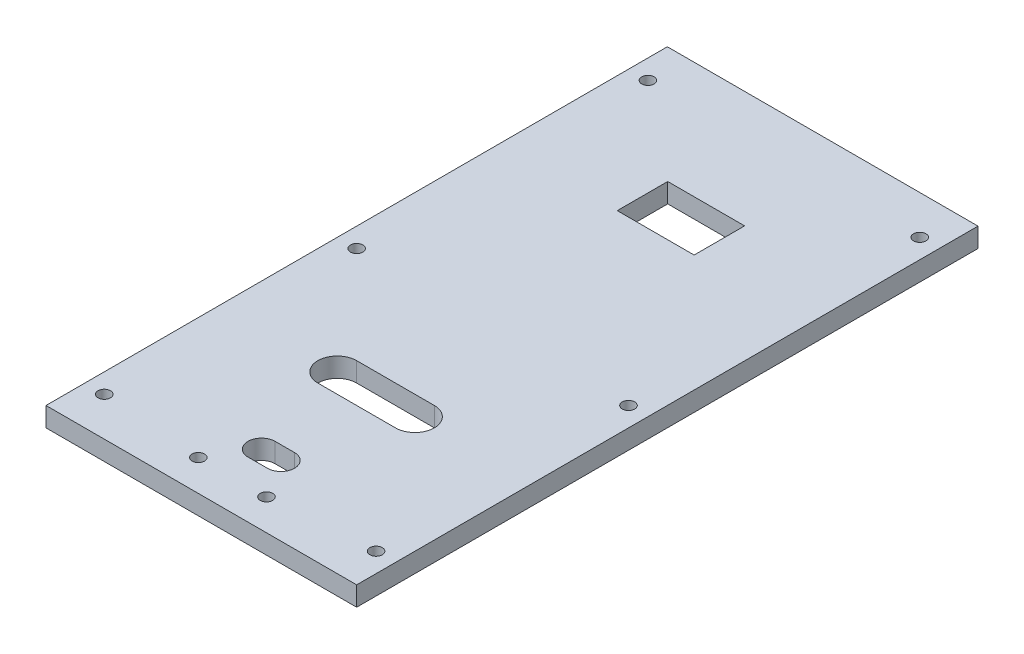
ISO-10303-21;
HEADER;
FILE_DESCRIPTION(('STEP AP214'),'2;1');
FILE_NAME('part.step','',(''),(''),'','','');
FILE_SCHEMA(('AUTOMOTIVE_DESIGN { 1 0 10303 214 1 1 1 1 }'));
ENDSEC;
DATA;
#1=APPLICATION_CONTEXT('core data for automotive mechanical design processes');
#2=APPLICATION_PROTOCOL_DEFINITION('international standard','automotive_design',2000,#1);
#3=PRODUCT_CONTEXT('',#1,'mechanical');
#4=PRODUCT('Part','Part','',(#3));
#5=PRODUCT_RELATED_PRODUCT_CATEGORY('part','',(#4));
#6=PRODUCT_DEFINITION_FORMATION('','',#4);
#7=PRODUCT_DEFINITION_CONTEXT('part definition',#1,'design');
#8=PRODUCT_DEFINITION('design','',#6,#7);
#9=PRODUCT_DEFINITION_SHAPE('','',#8);
#10=(LENGTH_UNIT() NAMED_UNIT(*) SI_UNIT(.MILLI.,.METRE.));
#11=(NAMED_UNIT(*) PLANE_ANGLE_UNIT() SI_UNIT($,.RADIAN.));
#12=(NAMED_UNIT(*) SI_UNIT($,.STERADIAN.) SOLID_ANGLE_UNIT());
#13=UNCERTAINTY_MEASURE_WITH_UNIT(LENGTH_MEASURE(1.E-05),#10,'distance_accuracy_value','');
#14=(GEOMETRIC_REPRESENTATION_CONTEXT(3) GLOBAL_UNCERTAINTY_ASSIGNED_CONTEXT((#13)) GLOBAL_UNIT_ASSIGNED_CONTEXT((#10,
#11,#12)) REPRESENTATION_CONTEXT('',''));
#15=CARTESIAN_POINT('',(0.,0.,0.));
#16=DIRECTION('',(0.,0.,1.));
#17=DIRECTION('',(1.,0.,0.));
#18=AXIS2_PLACEMENT_3D('',#15,#16,#17);
#19=CARTESIAN_POINT('',(0.,5.,0.));
#20=DIRECTION('',(0.,-1.,0.));
#21=DIRECTION('',(0.,0.,-1.));
#22=AXIS2_PLACEMENT_3D('',#19,#20,#21);
#23=PLANE('',#22);
#24=DIRECTION('',(1.,0.,0.));
#25=VECTOR('',#24,1.);
#26=CARTESIAN_POINT('',(30.,5.,-40.));
#27=LINE('',#26,#25);
#28=CARTESIAN_POINT('',(30.,5.,-40.));
#29=VERTEX_POINT('',#28);
#30=CARTESIAN_POINT('',(50.,5.,-40.));
#31=VERTEX_POINT('',#30);
#32=EDGE_CURVE('E176',#29,#31,#27,.T.);
#33=ORIENTED_EDGE('',*,*,#32,.F.);
#34=CARTESIAN_POINT('',(30.,5.,-45.));
#35=DIRECTION('',(0.,1.,0.));
#36=DIRECTION('',(0.,0.,1.));
#37=AXIS2_PLACEMENT_3D('',#34,#35,#36);
#38=CIRCLE('',#37,4.99999999999999);
#39=CARTESIAN_POINT('',(30.,5.,-50.));
#40=VERTEX_POINT('',#39);
#41=EDGE_CURVE('E51',#40,#29,#38,.T.);
#42=ORIENTED_EDGE('',*,*,#41,.F.);
#43=DIRECTION('',(-1.,0.,0.));
#44=VECTOR('',#43,1.);
#45=CARTESIAN_POINT('',(30.,5.,-50.));
#46=LINE('',#45,#44);
#47=CARTESIAN_POINT('',(50.,5.,-50.));
#48=VERTEX_POINT('',#47);
#49=EDGE_CURVE('E167',#48,#40,#46,.T.);
#50=ORIENTED_EDGE('',*,*,#49,.F.);
#51=CARTESIAN_POINT('',(50.,5.,-45.));
#52=DIRECTION('',(0.,1.,0.));
#53=DIRECTION('',(0.,0.,1.));
#54=AXIS2_PLACEMENT_3D('',#51,#52,#53);
#55=CIRCLE('',#54,4.99999999999999);
#56=EDGE_CURVE('E170',#31,#48,#55,.T.);
#57=ORIENTED_EDGE('',*,*,#56,.F.);
#58=EDGE_LOOP('',(#33,#42,#50,#57));
#59=FACE_BOUND('',#58,.T.);
#60=DIRECTION('',(1.,0.,0.));
#61=VECTOR('',#60,1.);
#62=CARTESIAN_POINT('',(37.5,5.,-14.5));
#63=LINE('',#62,#61);
#64=CARTESIAN_POINT('',(37.5,5.,-14.5));
#65=VERTEX_POINT('',#64);
#66=CARTESIAN_POINT('',(42.5,5.,-14.5));
#67=VERTEX_POINT('',#66);
#68=EDGE_CURVE('E201',#65,#67,#63,.T.);
#69=ORIENTED_EDGE('',*,*,#68,.F.);
#70=CARTESIAN_POINT('',(37.5,5.,-18.));
#71=DIRECTION('',(0.,1.,0.));
#72=DIRECTION('',(0.,0.,1.));
#73=AXIS2_PLACEMENT_3D('',#70,#71,#72);
#74=CIRCLE('',#73,3.5);
#75=CARTESIAN_POINT('',(37.5,5.,-21.5));
#76=VERTEX_POINT('',#75);
#77=EDGE_CURVE('E182',#76,#65,#74,.T.);
#78=ORIENTED_EDGE('',*,*,#77,.F.);
#79=DIRECTION('',(-1.,0.,0.));
#80=VECTOR('',#79,1.);
#81=CARTESIAN_POINT('',(37.5,5.,-21.5));
#82=LINE('',#81,#80);
#83=CARTESIAN_POINT('',(42.5,5.,-21.5));
#84=VERTEX_POINT('',#83);
#85=EDGE_CURVE('E190',#84,#76,#82,.T.);
#86=ORIENTED_EDGE('',*,*,#85,.F.);
#87=CARTESIAN_POINT('',(42.5,5.,-18.));
#88=DIRECTION('',(0.,1.,0.));
#89=DIRECTION('',(0.,0.,1.));
#90=AXIS2_PLACEMENT_3D('',#87,#88,#89);
#91=CIRCLE('',#90,3.5);
#92=EDGE_CURVE('E204',#67,#84,#91,.T.);
#93=ORIENTED_EDGE('',*,*,#92,.F.);
#94=EDGE_LOOP('',(#69,#78,#86,#93));
#95=FACE_BOUND('',#94,.T.);
#96=CARTESIAN_POINT('',(31.225,5.,-8.00000000000001));
#97=DIRECTION('',(0.,1.,0.));
#98=DIRECTION('',(0.,0.,1.));
#99=AXIS2_PLACEMENT_3D('',#96,#97,#98);
#100=CIRCLE('',#99,1.6);
#101=CARTESIAN_POINT('',(31.225,5.,-6.40000000000001));
#102=VERTEX_POINT('',#101);
#103=EDGE_CURVE('E218',#102,#102,#100,.T.);
#104=ORIENTED_EDGE('',*,*,#103,.F.);
#105=EDGE_LOOP('',(#104));
#106=FACE_BOUND('',#105,.T.);
#107=CARTESIAN_POINT('',(48.775,5.,-8.00000000000001));
#108=DIRECTION('',(0.,1.,0.));
#109=DIRECTION('',(0.,0.,-1.));
#110=AXIS2_PLACEMENT_3D('',#107,#108,#109);
#111=CIRCLE('',#110,1.6);
#112=CARTESIAN_POINT('',(48.775,5.,-9.60000000000001));
#113=VERTEX_POINT('',#112);
#114=EDGE_CURVE('E211',#113,#113,#111,.T.);
#115=ORIENTED_EDGE('',*,*,#114,.F.);
#116=EDGE_LOOP('',(#115));
#117=FACE_BOUND('',#116,.T.);
#118=DIRECTION('',(0.,0.,1.));
#119=VECTOR('',#118,1.);
#120=CARTESIAN_POINT('',(0.,5.,0.));
#121=LINE('',#120,#119);
#122=CARTESIAN_POINT('',(0.,5.,-160.));
#123=VERTEX_POINT('',#122);
#124=CARTESIAN_POINT('',(0.,5.,0.));
#125=VERTEX_POINT('',#124);
#126=EDGE_CURVE('E291',#123,#125,#121,.T.);
#127=ORIENTED_EDGE('',*,*,#126,.T.);
#128=DIRECTION('',(1.,0.,0.));
#129=VECTOR('',#128,1.);
#130=CARTESIAN_POINT('',(0.,5.,0.));
#131=LINE('',#130,#129);
#132=CARTESIAN_POINT('',(80.,5.,0.));
#133=VERTEX_POINT('',#132);
#134=EDGE_CURVE('E294',#125,#133,#131,.T.);
#135=ORIENTED_EDGE('',*,*,#134,.T.);
#136=DIRECTION('',(0.,0.,-1.));
#137=VECTOR('',#136,1.);
#138=CARTESIAN_POINT('',(80.,5.,0.));
#139=LINE('',#138,#137);
#140=CARTESIAN_POINT('',(80.,5.,-160.));
#141=VERTEX_POINT('',#140);
#142=EDGE_CURVE('E297',#133,#141,#139,.T.);
#143=ORIENTED_EDGE('',*,*,#142,.T.);
#144=DIRECTION('',(-1.,0.,0.));
#145=VECTOR('',#144,1.);
#146=CARTESIAN_POINT('',(0.,5.,-160.));
#147=LINE('',#146,#145);
#148=EDGE_CURVE('E299',#141,#123,#147,.T.);
#149=ORIENTED_EDGE('',*,*,#148,.T.);
#150=EDGE_LOOP('',(#127,#135,#143,#149));
#151=FACE_BOUND('',#150,.T.);
#152=CARTESIAN_POINT('',(5.,5.,-150.));
#153=DIRECTION('',(0.,-1.,0.));
#154=DIRECTION('',(0.,0.,-1.));
#155=AXIS2_PLACEMENT_3D('',#152,#153,#154);
#156=CIRCLE('',#155,1.59999999999999);
#157=CARTESIAN_POINT('',(5.,5.,-151.6));
#158=VERTEX_POINT('',#157);
#159=EDGE_CURVE('E272',#158,#158,#156,.F.);
#160=ORIENTED_EDGE('',*,*,#159,.F.);
#161=EDGE_LOOP('',(#160));
#162=FACE_BOUND('',#161,.T.);
#163=CARTESIAN_POINT('',(5.00000000000001,5.,-75.));
#164=DIRECTION('',(0.,-1.,0.));
#165=DIRECTION('',(0.,0.,-1.));
#166=AXIS2_PLACEMENT_3D('',#163,#164,#165);
#167=CIRCLE('',#166,1.6);
#168=CARTESIAN_POINT('',(5.00000000000001,5.,-76.6));
#169=VERTEX_POINT('',#168);
#170=EDGE_CURVE('E275',#169,#169,#167,.F.);
#171=ORIENTED_EDGE('',*,*,#170,.F.);
#172=EDGE_LOOP('',(#171));
#173=FACE_BOUND('',#172,.T.);
#174=CARTESIAN_POINT('',(5.00000000000002,5.,-10.));
#175=DIRECTION('',(0.,-1.,0.));
#176=DIRECTION('',(0.,0.,-1.));
#177=AXIS2_PLACEMENT_3D('',#174,#175,#176);
#178=CIRCLE('',#177,1.6);
#179=CARTESIAN_POINT('',(5.00000000000002,5.,-11.6));
#180=VERTEX_POINT('',#179);
#181=EDGE_CURVE('E278',#180,#180,#178,.F.);
#182=ORIENTED_EDGE('',*,*,#181,.F.);
#183=EDGE_LOOP('',(#182));
#184=FACE_BOUND('',#183,.T.);
#185=CARTESIAN_POINT('',(75.,5.,-10.));
#186=DIRECTION('',(0.,-1.,0.));
#187=DIRECTION('',(0.,0.,-1.));
#188=AXIS2_PLACEMENT_3D('',#185,#186,#187);
#189=CIRCLE('',#188,1.59999999999999);
#190=CARTESIAN_POINT('',(75.,5.,-11.6));
#191=VERTEX_POINT('',#190);
#192=EDGE_CURVE('E281',#191,#191,#189,.F.);
#193=ORIENTED_EDGE('',*,*,#192,.F.);
#194=EDGE_LOOP('',(#193));
#195=FACE_BOUND('',#194,.T.);
#196=CARTESIAN_POINT('',(75.,5.,-75.));
#197=DIRECTION('',(0.,-1.,0.));
#198=DIRECTION('',(0.,0.,-1.));
#199=AXIS2_PLACEMENT_3D('',#196,#197,#198);
#200=CIRCLE('',#199,1.59999999999999);
#201=CARTESIAN_POINT('',(75.,5.,-76.6));
#202=VERTEX_POINT('',#201);
#203=EDGE_CURVE('E284',#202,#202,#200,.F.);
#204=ORIENTED_EDGE('',*,*,#203,.F.);
#205=EDGE_LOOP('',(#204));
#206=FACE_BOUND('',#205,.T.);
#207=CARTESIAN_POINT('',(75.,5.,-150.));
#208=DIRECTION('',(0.,-1.,0.));
#209=DIRECTION('',(0.,0.,-1.));
#210=AXIS2_PLACEMENT_3D('',#207,#208,#209);
#211=CIRCLE('',#210,1.6);
#212=CARTESIAN_POINT('',(75.,5.,-151.6));
#213=VERTEX_POINT('',#212);
#214=EDGE_CURVE('E287',#213,#213,#211,.F.);
#215=ORIENTED_EDGE('',*,*,#214,.F.);
#216=EDGE_LOOP('',(#215));
#217=FACE_BOUND('',#216,.T.);
#218=DIRECTION('',(0.,0.,1.));
#219=VECTOR('',#218,1.);
#220=CARTESIAN_POINT('',(30.0999999999999,5.,0.));
#221=LINE('',#220,#219);
#222=CARTESIAN_POINT('',(30.1,5.,-130.));
#223=VERTEX_POINT('',#222);
#224=CARTESIAN_POINT('',(30.1,5.,-117.));
#225=VERTEX_POINT('',#224);
#226=EDGE_CURVE('E252',#223,#225,#221,.T.);
#227=ORIENTED_EDGE('',*,*,#226,.F.);
#228=DIRECTION('',(-1.,0.,0.));
#229=VECTOR('',#228,1.);
#230=CARTESIAN_POINT('',(0.,5.,-130.));
#231=LINE('',#230,#229);
#232=CARTESIAN_POINT('',(49.9,5.,-130.));
#233=VERTEX_POINT('',#232);
#234=EDGE_CURVE('E245',#233,#223,#231,.T.);
#235=ORIENTED_EDGE('',*,*,#234,.F.);
#236=DIRECTION('',(0.,0.,-1.));
#237=VECTOR('',#236,1.);
#238=CARTESIAN_POINT('',(49.9000000000001,5.,0.));
#239=LINE('',#238,#237);
#240=CARTESIAN_POINT('',(49.9,5.,-117.));
#241=VERTEX_POINT('',#240);
#242=EDGE_CURVE('E247',#241,#233,#239,.T.);
#243=ORIENTED_EDGE('',*,*,#242,.F.);
#244=DIRECTION('',(1.,0.,0.));
#245=VECTOR('',#244,1.);
#246=CARTESIAN_POINT('',(0.,5.,-117.));
#247=LINE('',#246,#245);
#248=EDGE_CURVE('E250',#225,#241,#247,.T.);
#249=ORIENTED_EDGE('',*,*,#248,.F.);
#250=EDGE_LOOP('',(#227,#235,#243,#249));
#251=FACE_BOUND('',#250,.T.);
#252=ADVANCED_FACE('F34',(#59,#95,#106,#117,#151,#162,#173,#184,#195,#206,#217,#251),#23,.F.);
#253=CARTESIAN_POINT('',(0.,0.,0.));
#254=DIRECTION('',(0.,-1.,0.));
#255=DIRECTION('',(0.,0.,-1.));
#256=AXIS2_PLACEMENT_3D('',#253,#254,#255);
#257=PLANE('',#256);
#258=CARTESIAN_POINT('',(30.,0.,-45.));
#259=DIRECTION('',(0.,1.,0.));
#260=DIRECTION('',(0.,0.,1.));
#261=AXIS2_PLACEMENT_3D('',#258,#259,#260);
#262=CIRCLE('',#261,4.99999999999999);
#263=CARTESIAN_POINT('',(30.,0.,-50.));
#264=VERTEX_POINT('',#263);
#265=CARTESIAN_POINT('',(30.,0.,-40.));
#266=VERTEX_POINT('',#265);
#267=EDGE_CURVE('E151',#264,#266,#262,.T.);
#268=ORIENTED_EDGE('',*,*,#267,.T.);
#269=DIRECTION('',(1.,0.,0.));
#270=VECTOR('',#269,1.);
#271=CARTESIAN_POINT('',(30.,0.,-40.));
#272=LINE('',#271,#270);
#273=CARTESIAN_POINT('',(50.,0.,-40.));
#274=VERTEX_POINT('',#273);
#275=EDGE_CURVE('E160',#266,#274,#272,.T.);
#276=ORIENTED_EDGE('',*,*,#275,.T.);
#277=CARTESIAN_POINT('',(50.,0.,-45.));
#278=DIRECTION('',(0.,1.,0.));
#279=DIRECTION('',(0.,0.,1.));
#280=AXIS2_PLACEMENT_3D('',#277,#278,#279);
#281=CIRCLE('',#280,4.99999999999999);
#282=CARTESIAN_POINT('',(50.,0.,-50.));
#283=VERTEX_POINT('',#282);
#284=EDGE_CURVE('E59',#274,#283,#281,.T.);
#285=ORIENTED_EDGE('',*,*,#284,.T.);
#286=DIRECTION('',(-1.,0.,0.));
#287=VECTOR('',#286,1.);
#288=CARTESIAN_POINT('',(30.,0.,-50.));
#289=LINE('',#288,#287);
#290=EDGE_CURVE('E157',#283,#264,#289,.T.);
#291=ORIENTED_EDGE('',*,*,#290,.T.);
#292=EDGE_LOOP('',(#268,#276,#285,#291));
#293=FACE_BOUND('',#292,.T.);
#294=CARTESIAN_POINT('',(37.5,0.,-18.));
#295=DIRECTION('',(0.,1.,0.));
#296=DIRECTION('',(0.,0.,1.));
#297=AXIS2_PLACEMENT_3D('',#294,#295,#296);
#298=CIRCLE('',#297,3.5);
#299=CARTESIAN_POINT('',(37.5,0.,-21.5));
#300=VERTEX_POINT('',#299);
#301=CARTESIAN_POINT('',(37.5,0.,-14.5));
#302=VERTEX_POINT('',#301);
#303=EDGE_CURVE('E186',#300,#302,#298,.T.);
#304=ORIENTED_EDGE('',*,*,#303,.T.);
#305=DIRECTION('',(1.,0.,0.));
#306=VECTOR('',#305,1.);
#307=CARTESIAN_POINT('',(37.5,0.,-14.5));
#308=LINE('',#307,#306);
#309=CARTESIAN_POINT('',(42.5,0.,-14.5));
#310=VERTEX_POINT('',#309);
#311=EDGE_CURVE('E189',#302,#310,#308,.T.);
#312=ORIENTED_EDGE('',*,*,#311,.T.);
#313=CARTESIAN_POINT('',(42.5,0.,-18.));
#314=DIRECTION('',(0.,1.,0.));
#315=DIRECTION('',(0.,0.,1.));
#316=AXIS2_PLACEMENT_3D('',#313,#314,#315);
#317=CIRCLE('',#316,3.5);
#318=CARTESIAN_POINT('',(42.5,0.,-21.5));
#319=VERTEX_POINT('',#318);
#320=EDGE_CURVE('E193',#310,#319,#317,.T.);
#321=ORIENTED_EDGE('',*,*,#320,.T.);
#322=DIRECTION('',(-1.,0.,0.));
#323=VECTOR('',#322,1.);
#324=CARTESIAN_POINT('',(37.5,0.,-21.5));
#325=LINE('',#324,#323);
#326=EDGE_CURVE('E196',#319,#300,#325,.T.);
#327=ORIENTED_EDGE('',*,*,#326,.T.);
#328=EDGE_LOOP('',(#304,#312,#321,#327));
#329=FACE_BOUND('',#328,.T.);
#330=CARTESIAN_POINT('',(31.225,0.,-8.00000000000001));
#331=DIRECTION('',(0.,-1.,0.));
#332=DIRECTION('',(0.,0.,-1.));
#333=AXIS2_PLACEMENT_3D('',#330,#331,#332);
#334=CIRCLE('',#333,1.6);
#335=CARTESIAN_POINT('',(31.225,0.,-9.60000000000001));
#336=VERTEX_POINT('',#335);
#337=EDGE_CURVE('E38',#336,#336,#334,.T.);
#338=ORIENTED_EDGE('',*,*,#337,.F.);
#339=EDGE_LOOP('',(#338));
#340=FACE_BOUND('',#339,.T.);
#341=CARTESIAN_POINT('',(48.775,0.,-8.00000000000001));
#342=DIRECTION('',(0.,-1.,0.));
#343=DIRECTION('',(0.,0.,-1.));
#344=AXIS2_PLACEMENT_3D('',#341,#342,#343);
#345=CIRCLE('',#344,1.6);
#346=CARTESIAN_POINT('',(48.775,0.,-9.60000000000001));
#347=VERTEX_POINT('',#346);
#348=EDGE_CURVE('E221',#347,#347,#345,.T.);
#349=ORIENTED_EDGE('',*,*,#348,.F.);
#350=EDGE_LOOP('',(#349));
#351=FACE_BOUND('',#350,.T.);
#352=CARTESIAN_POINT('',(75.,0.,-150.));
#353=DIRECTION('',(0.,1.,0.));
#354=DIRECTION('',(0.,0.,-1.));
#355=AXIS2_PLACEMENT_3D('',#352,#353,#354);
#356=CIRCLE('',#355,1.6);
#357=CARTESIAN_POINT('',(75.,0.,-151.6));
#358=VERTEX_POINT('',#357);
#359=EDGE_CURVE('E254',#358,#358,#356,.T.);
#360=ORIENTED_EDGE('',*,*,#359,.T.);
#361=EDGE_LOOP('',(#360));
#362=FACE_BOUND('',#361,.T.);
#363=CARTESIAN_POINT('',(75.,0.,-75.));
#364=DIRECTION('',(0.,1.,0.));
#365=DIRECTION('',(0.,0.,-1.));
#366=AXIS2_PLACEMENT_3D('',#363,#364,#365);
#367=CIRCLE('',#366,1.59999999999999);
#368=CARTESIAN_POINT('',(75.,0.,-76.6));
#369=VERTEX_POINT('',#368);
#370=EDGE_CURVE('E265',#369,#369,#367,.T.);
#371=ORIENTED_EDGE('',*,*,#370,.T.);
#372=EDGE_LOOP('',(#371));
#373=FACE_BOUND('',#372,.T.);
#374=CARTESIAN_POINT('',(75.,0.,-10.));
#375=DIRECTION('',(0.,1.,0.));
#376=DIRECTION('',(0.,0.,-1.));
#377=AXIS2_PLACEMENT_3D('',#374,#375,#376);
#378=CIRCLE('',#377,1.59999999999999);
#379=CARTESIAN_POINT('',(75.,0.,-11.6));
#380=VERTEX_POINT('',#379);
#381=EDGE_CURVE('E262',#380,#380,#378,.T.);
#382=ORIENTED_EDGE('',*,*,#381,.T.);
#383=EDGE_LOOP('',(#382));
#384=FACE_BOUND('',#383,.T.);
#385=CARTESIAN_POINT('',(5.00000000000002,0.,-10.));
#386=DIRECTION('',(0.,1.,0.));
#387=DIRECTION('',(0.,0.,1.));
#388=AXIS2_PLACEMENT_3D('',#385,#386,#387);
#389=CIRCLE('',#388,1.6);
#390=CARTESIAN_POINT('',(5.00000000000002,0.,-8.40000000000001));
#391=VERTEX_POINT('',#390);
#392=EDGE_CURVE('E259',#391,#391,#389,.T.);
#393=ORIENTED_EDGE('',*,*,#392,.T.);
#394=EDGE_LOOP('',(#393));
#395=FACE_BOUND('',#394,.T.);
#396=CARTESIAN_POINT('',(5.00000000000001,0.,-75.));
#397=DIRECTION('',(0.,1.,0.));
#398=DIRECTION('',(0.,0.,1.));
#399=AXIS2_PLACEMENT_3D('',#396,#397,#398);
#400=CIRCLE('',#399,1.6);
#401=CARTESIAN_POINT('',(5.00000000000001,0.,-73.4));
#402=VERTEX_POINT('',#401);
#403=EDGE_CURVE('E255',#402,#402,#400,.T.);
#404=ORIENTED_EDGE('',*,*,#403,.T.);
#405=EDGE_LOOP('',(#404));
#406=FACE_BOUND('',#405,.T.);
#407=CARTESIAN_POINT('',(5.,0.,-150.));
#408=DIRECTION('',(0.,1.,0.));
#409=DIRECTION('',(0.,0.,1.));
#410=AXIS2_PLACEMENT_3D('',#407,#408,#409);
#411=CIRCLE('',#410,1.59999999999999);
#412=CARTESIAN_POINT('',(5.,0.,-148.4));
#413=VERTEX_POINT('',#412);
#414=EDGE_CURVE('E258',#413,#413,#411,.T.);
#415=ORIENTED_EDGE('',*,*,#414,.T.);
#416=EDGE_LOOP('',(#415));
#417=FACE_BOUND('',#416,.T.);
#418=DIRECTION('',(0.,0.,1.));
#419=VECTOR('',#418,1.);
#420=CARTESIAN_POINT('',(0.,0.,0.));
#421=LINE('',#420,#419);
#422=CARTESIAN_POINT('',(0.,0.,-160.));
#423=VERTEX_POINT('',#422);
#424=CARTESIAN_POINT('',(0.,0.,0.));
#425=VERTEX_POINT('',#424);
#426=EDGE_CURVE('E290',#423,#425,#421,.T.);
#427=ORIENTED_EDGE('',*,*,#426,.F.);
#428=DIRECTION('',(-1.,0.,0.));
#429=VECTOR('',#428,1.);
#430=CARTESIAN_POINT('',(0.,0.,-160.));
#431=LINE('',#430,#429);
#432=CARTESIAN_POINT('',(80.,0.,-160.));
#433=VERTEX_POINT('',#432);
#434=EDGE_CURVE('E295',#433,#423,#431,.T.);
#435=ORIENTED_EDGE('',*,*,#434,.F.);
#436=DIRECTION('',(0.,0.,-1.));
#437=VECTOR('',#436,1.);
#438=CARTESIAN_POINT('',(80.,0.,0.));
#439=LINE('',#438,#437);
#440=CARTESIAN_POINT('',(80.,0.,0.));
#441=VERTEX_POINT('',#440);
#442=EDGE_CURVE('E306',#441,#433,#439,.T.);
#443=ORIENTED_EDGE('',*,*,#442,.F.);
#444=DIRECTION('',(1.,0.,0.));
#445=VECTOR('',#444,1.);
#446=CARTESIAN_POINT('',(0.,0.,0.));
#447=LINE('',#446,#445);
#448=EDGE_CURVE('E304',#425,#441,#447,.T.);
#449=ORIENTED_EDGE('',*,*,#448,.F.);
#450=EDGE_LOOP('',(#427,#435,#443,#449));
#451=FACE_BOUND('',#450,.T.);
#452=DIRECTION('',(-1.,0.,0.));
#453=VECTOR('',#452,1.);
#454=CARTESIAN_POINT('',(30.1,0.,-130.));
#455=LINE('',#454,#453);
#456=CARTESIAN_POINT('',(49.9,0.,-130.));
#457=VERTEX_POINT('',#456);
#458=CARTESIAN_POINT('',(30.1,0.,-130.));
#459=VERTEX_POINT('',#458);
#460=EDGE_CURVE('E233',#457,#459,#455,.T.);
#461=ORIENTED_EDGE('',*,*,#460,.T.);
#462=DIRECTION('',(0.,0.,1.));
#463=VECTOR('',#462,1.);
#464=CARTESIAN_POINT('',(30.1,0.,-130.));
#465=LINE('',#464,#463);
#466=CARTESIAN_POINT('',(30.1,0.,-117.));
#467=VERTEX_POINT('',#466);
#468=EDGE_CURVE('E224',#459,#467,#465,.T.);
#469=ORIENTED_EDGE('',*,*,#468,.T.);
#470=DIRECTION('',(1.,0.,0.));
#471=VECTOR('',#470,1.);
#472=CARTESIAN_POINT('',(30.1,0.,-117.));
#473=LINE('',#472,#471);
#474=CARTESIAN_POINT('',(49.9,0.,-117.));
#475=VERTEX_POINT('',#474);
#476=EDGE_CURVE('E227',#467,#475,#473,.T.);
#477=ORIENTED_EDGE('',*,*,#476,.T.);
#478=DIRECTION('',(0.,0.,-1.));
#479=VECTOR('',#478,1.);
#480=CARTESIAN_POINT('',(49.9,0.,-130.));
#481=LINE('',#480,#479);
#482=EDGE_CURVE('E230',#475,#457,#481,.T.);
#483=ORIENTED_EDGE('',*,*,#482,.T.);
#484=EDGE_LOOP('',(#461,#469,#477,#483));
#485=FACE_BOUND('',#484,.T.);
#486=ADVANCED_FACE('F164',(#293,#329,#340,#351,#362,#373,#384,#395,#406,#417,#451,#485),#257,.T.);
#487=CARTESIAN_POINT('',(0.,5.,0.));
#488=DIRECTION('',(1.,0.,0.));
#489=DIRECTION('',(0.,0.,-1.));
#490=AXIS2_PLACEMENT_3D('',#487,#488,#489);
#491=PLANE('',#490);
#492=ORIENTED_EDGE('',*,*,#426,.T.);
#493=DIRECTION('',(0.,-1.,0.));
#494=VECTOR('',#493,1.);
#495=CARTESIAN_POINT('',(0.,5.,0.));
#496=LINE('',#495,#494);
#497=EDGE_CURVE('E11',#125,#425,#496,.T.);
#498=ORIENTED_EDGE('',*,*,#497,.F.);
#499=ORIENTED_EDGE('',*,*,#126,.F.);
#500=DIRECTION('',(0.,-1.,0.));
#501=VECTOR('',#500,1.);
#502=CARTESIAN_POINT('',(0.,5.,-160.));
#503=LINE('',#502,#501);
#504=EDGE_CURVE('E301',#123,#423,#503,.T.);
#505=ORIENTED_EDGE('',*,*,#504,.T.);
#506=EDGE_LOOP('',(#492,#498,#499,#505));
#507=FACE_BOUND('',#506,.T.);
#508=ADVANCED_FACE('F36',(#507),#491,.F.);
#509=CARTESIAN_POINT('',(0.,5.,0.));
#510=DIRECTION('',(0.,0.,-1.));
#511=DIRECTION('',(-1.,0.,0.));
#512=AXIS2_PLACEMENT_3D('',#509,#510,#511);
#513=PLANE('',#512);
#514=ORIENTED_EDGE('',*,*,#448,.T.);
#515=DIRECTION('',(0.,-1.,0.));
#516=VECTOR('',#515,1.);
#517=CARTESIAN_POINT('',(80.,5.,0.));
#518=LINE('',#517,#516);
#519=EDGE_CURVE('E43',#133,#441,#518,.T.);
#520=ORIENTED_EDGE('',*,*,#519,.F.);
#521=ORIENTED_EDGE('',*,*,#134,.F.);
#522=ORIENTED_EDGE('',*,*,#497,.T.);
#523=EDGE_LOOP('',(#514,#520,#521,#522));
#524=FACE_BOUND('',#523,.T.);
#525=ADVANCED_FACE('F388',(#524),#513,.F.);
#526=CARTESIAN_POINT('',(80.,5.,0.));
#527=DIRECTION('',(-1.,0.,0.));
#528=DIRECTION('',(0.,0.,1.));
#529=AXIS2_PLACEMENT_3D('',#526,#527,#528);
#530=PLANE('',#529);
#531=ORIENTED_EDGE('',*,*,#442,.T.);
#532=DIRECTION('',(0.,-1.,0.));
#533=VECTOR('',#532,1.);
#534=CARTESIAN_POINT('',(80.,5.,-160.));
#535=LINE('',#534,#533);
#536=EDGE_CURVE('E311',#141,#433,#535,.T.);
#537=ORIENTED_EDGE('',*,*,#536,.F.);
#538=ORIENTED_EDGE('',*,*,#142,.F.);
#539=ORIENTED_EDGE('',*,*,#519,.T.);
#540=EDGE_LOOP('',(#531,#537,#538,#539));
#541=FACE_BOUND('',#540,.T.);
#542=ADVANCED_FACE('F385',(#541),#530,.F.);
#543=CARTESIAN_POINT('',(0.,5.,-160.));
#544=DIRECTION('',(0.,0.,1.));
#545=DIRECTION('',(1.,0.,0.));
#546=AXIS2_PLACEMENT_3D('',#543,#544,#545);
#547=PLANE('',#546);
#548=ORIENTED_EDGE('',*,*,#434,.T.);
#549=ORIENTED_EDGE('',*,*,#504,.F.);
#550=ORIENTED_EDGE('',*,*,#148,.F.);
#551=ORIENTED_EDGE('',*,*,#536,.T.);
#552=EDGE_LOOP('',(#548,#549,#550,#551));
#553=FACE_BOUND('',#552,.T.);
#554=ADVANCED_FACE('F382',(#553),#547,.F.);
#555=CARTESIAN_POINT('',(5.,10.,-150.));
#556=DIRECTION('',(0.,-1.,0.));
#557=DIRECTION('',(0.,0.,-1.));
#558=AXIS2_PLACEMENT_3D('',#555,#556,#557);
#559=CYLINDRICAL_SURFACE('',#558,1.59999999999999);
#560=ORIENTED_EDGE('',*,*,#414,.F.);
#561=EDGE_LOOP('',(#560));
#562=FACE_BOUND('',#561,.T.);
#563=ORIENTED_EDGE('',*,*,#159,.T.);
#564=EDGE_LOOP('',(#563));
#565=FACE_BOUND('',#564,.T.);
#566=ADVANCED_FACE('F379',(#562,#565),#559,.F.);
#567=CARTESIAN_POINT('',(5.00000000000001,10.,-75.));
#568=DIRECTION('',(0.,-1.,0.));
#569=DIRECTION('',(0.,0.,-1.));
#570=AXIS2_PLACEMENT_3D('',#567,#568,#569);
#571=CYLINDRICAL_SURFACE('',#570,1.6);
#572=ORIENTED_EDGE('',*,*,#403,.F.);
#573=EDGE_LOOP('',(#572));
#574=FACE_BOUND('',#573,.T.);
#575=ORIENTED_EDGE('',*,*,#170,.T.);
#576=EDGE_LOOP('',(#575));
#577=FACE_BOUND('',#576,.T.);
#578=ADVANCED_FACE('F437',(#574,#577),#571,.F.);
#579=CARTESIAN_POINT('',(5.00000000000002,10.,-10.));
#580=DIRECTION('',(0.,-1.,0.));
#581=DIRECTION('',(0.,0.,-1.));
#582=AXIS2_PLACEMENT_3D('',#579,#580,#581);
#583=CYLINDRICAL_SURFACE('',#582,1.6);
#584=ORIENTED_EDGE('',*,*,#392,.F.);
#585=EDGE_LOOP('',(#584));
#586=FACE_BOUND('',#585,.T.);
#587=ORIENTED_EDGE('',*,*,#181,.T.);
#588=EDGE_LOOP('',(#587));
#589=FACE_BOUND('',#588,.T.);
#590=ADVANCED_FACE('F433',(#586,#589),#583,.F.);
#591=CARTESIAN_POINT('',(75.,10.,-10.));
#592=DIRECTION('',(0.,-1.,0.));
#593=DIRECTION('',(0.,0.,-1.));
#594=AXIS2_PLACEMENT_3D('',#591,#592,#593);
#595=CYLINDRICAL_SURFACE('',#594,1.59999999999999);
#596=ORIENTED_EDGE('',*,*,#381,.F.);
#597=EDGE_LOOP('',(#596));
#598=FACE_BOUND('',#597,.T.);
#599=ORIENTED_EDGE('',*,*,#192,.T.);
#600=EDGE_LOOP('',(#599));
#601=FACE_BOUND('',#600,.T.);
#602=ADVANCED_FACE('F427',(#598,#601),#595,.F.);
#603=CARTESIAN_POINT('',(75.,10.,-75.));
#604=DIRECTION('',(0.,-1.,0.));
#605=DIRECTION('',(0.,0.,-1.));
#606=AXIS2_PLACEMENT_3D('',#603,#604,#605);
#607=CYLINDRICAL_SURFACE('',#606,1.59999999999999);
#608=ORIENTED_EDGE('',*,*,#370,.F.);
#609=EDGE_LOOP('',(#608));
#610=FACE_BOUND('',#609,.T.);
#611=ORIENTED_EDGE('',*,*,#203,.T.);
#612=EDGE_LOOP('',(#611));
#613=FACE_BOUND('',#612,.T.);
#614=ADVANCED_FACE('F420',(#610,#613),#607,.F.);
#615=CARTESIAN_POINT('',(75.,10.,-150.));
#616=DIRECTION('',(0.,-1.,0.));
#617=DIRECTION('',(0.,0.,-1.));
#618=AXIS2_PLACEMENT_3D('',#615,#616,#617);
#619=CYLINDRICAL_SURFACE('',#618,1.6);
#620=ORIENTED_EDGE('',*,*,#359,.F.);
#621=EDGE_LOOP('',(#620));
#622=FACE_BOUND('',#621,.T.);
#623=ORIENTED_EDGE('',*,*,#214,.T.);
#624=EDGE_LOOP('',(#623));
#625=FACE_BOUND('',#624,.T.);
#626=ADVANCED_FACE('F418',(#622,#625),#619,.F.);
#627=CARTESIAN_POINT('',(30.1,10.,-130.));
#628=DIRECTION('',(1.,0.,0.));
#629=DIRECTION('',(0.,0.,-1.));
#630=AXIS2_PLACEMENT_3D('',#627,#628,#629);
#631=PLANE('',#630);
#632=ORIENTED_EDGE('',*,*,#226,.T.);
#633=DIRECTION('',(0.,-1.,0.));
#634=VECTOR('',#633,1.);
#635=CARTESIAN_POINT('',(30.1,10.,-117.));
#636=LINE('',#635,#634);
#637=EDGE_CURVE('E243',#225,#467,#636,.T.);
#638=ORIENTED_EDGE('',*,*,#637,.T.);
#639=ORIENTED_EDGE('',*,*,#468,.F.);
#640=DIRECTION('',(0.,-1.,0.));
#641=VECTOR('',#640,1.);
#642=CARTESIAN_POINT('',(30.1,10.,-130.));
#643=LINE('',#642,#641);
#644=EDGE_CURVE('E236',#223,#459,#643,.T.);
#645=ORIENTED_EDGE('',*,*,#644,.F.);
#646=EDGE_LOOP('',(#632,#638,#639,#645));
#647=FACE_BOUND('',#646,.T.);
#648=ADVANCED_FACE('F351',(#647),#631,.T.);
#649=CARTESIAN_POINT('',(30.1,10.,-117.));
#650=DIRECTION('',(0.,0.,-1.));
#651=DIRECTION('',(-1.,0.,0.));
#652=AXIS2_PLACEMENT_3D('',#649,#650,#651);
#653=PLANE('',#652);
#654=ORIENTED_EDGE('',*,*,#248,.T.);
#655=DIRECTION('',(0.,-1.,0.));
#656=VECTOR('',#655,1.);
#657=CARTESIAN_POINT('',(49.9,10.,-117.));
#658=LINE('',#657,#656);
#659=EDGE_CURVE('E241',#241,#475,#658,.T.);
#660=ORIENTED_EDGE('',*,*,#659,.T.);
#661=ORIENTED_EDGE('',*,*,#476,.F.);
#662=ORIENTED_EDGE('',*,*,#637,.F.);
#663=EDGE_LOOP('',(#654,#660,#661,#662));
#664=FACE_BOUND('',#663,.T.);
#665=ADVANCED_FACE('F358',(#664),#653,.T.);
#666=CARTESIAN_POINT('',(49.9,10.,-130.));
#667=DIRECTION('',(-1.,0.,0.));
#668=DIRECTION('',(0.,0.,1.));
#669=AXIS2_PLACEMENT_3D('',#666,#667,#668);
#670=PLANE('',#669);
#671=ORIENTED_EDGE('',*,*,#242,.T.);
#672=DIRECTION('',(0.,-1.,0.));
#673=VECTOR('',#672,1.);
#674=CARTESIAN_POINT('',(49.9,10.,-130.));
#675=LINE('',#674,#673);
#676=EDGE_CURVE('E239',#233,#457,#675,.T.);
#677=ORIENTED_EDGE('',*,*,#676,.T.);
#678=ORIENTED_EDGE('',*,*,#482,.F.);
#679=ORIENTED_EDGE('',*,*,#659,.F.);
#680=EDGE_LOOP('',(#671,#677,#678,#679));
#681=FACE_BOUND('',#680,.T.);
#682=ADVANCED_FACE('F361',(#681),#670,.T.);
#683=CARTESIAN_POINT('',(30.1,10.,-130.));
#684=DIRECTION('',(0.,0.,1.));
#685=DIRECTION('',(1.,0.,0.));
#686=AXIS2_PLACEMENT_3D('',#683,#684,#685);
#687=PLANE('',#686);
#688=ORIENTED_EDGE('',*,*,#234,.T.);
#689=ORIENTED_EDGE('',*,*,#644,.T.);
#690=ORIENTED_EDGE('',*,*,#460,.F.);
#691=ORIENTED_EDGE('',*,*,#676,.F.);
#692=EDGE_LOOP('',(#688,#689,#690,#691));
#693=FACE_BOUND('',#692,.T.);
#694=ADVANCED_FACE('F346',(#693),#687,.T.);
#695=CARTESIAN_POINT('',(48.775,-5.,-8.00000000000001));
#696=DIRECTION('',(0.,1.,0.));
#697=DIRECTION('',(0.,0.,1.));
#698=AXIS2_PLACEMENT_3D('',#695,#696,#697);
#699=CYLINDRICAL_SURFACE('',#698,1.6);
#700=ORIENTED_EDGE('',*,*,#348,.T.);
#701=EDGE_LOOP('',(#700));
#702=FACE_BOUND('',#701,.T.);
#703=ORIENTED_EDGE('',*,*,#114,.T.);
#704=EDGE_LOOP('',(#703));
#705=FACE_BOUND('',#704,.T.);
#706=ADVANCED_FACE('F368',(#702,#705),#699,.F.);
#707=CARTESIAN_POINT('',(31.225,-5.,-8.00000000000001));
#708=DIRECTION('',(0.,1.,0.));
#709=DIRECTION('',(0.,0.,1.));
#710=AXIS2_PLACEMENT_3D('',#707,#708,#709);
#711=CYLINDRICAL_SURFACE('',#710,1.6);
#712=ORIENTED_EDGE('',*,*,#337,.T.);
#713=EDGE_LOOP('',(#712));
#714=FACE_BOUND('',#713,.T.);
#715=ORIENTED_EDGE('',*,*,#103,.T.);
#716=EDGE_LOOP('',(#715));
#717=FACE_BOUND('',#716,.T.);
#718=ADVANCED_FACE('F321',(#714,#717),#711,.F.);
#719=CARTESIAN_POINT('',(37.5,0.,-18.));
#720=DIRECTION('',(0.,1.,0.));
#721=DIRECTION('',(0.,0.,1.));
#722=AXIS2_PLACEMENT_3D('',#719,#720,#721);
#723=CYLINDRICAL_SURFACE('',#722,3.5);
#724=ORIENTED_EDGE('',*,*,#77,.T.);
#725=DIRECTION('',(0.,1.,0.));
#726=VECTOR('',#725,1.);
#727=CARTESIAN_POINT('',(37.5,0.,-14.5));
#728=LINE('',#727,#726);
#729=EDGE_CURVE('E199',#302,#65,#728,.T.);
#730=ORIENTED_EDGE('',*,*,#729,.F.);
#731=ORIENTED_EDGE('',*,*,#303,.F.);
#732=DIRECTION('',(0.,1.,0.));
#733=VECTOR('',#732,1.);
#734=CARTESIAN_POINT('',(37.5,0.,-21.5));
#735=LINE('',#734,#733);
#736=EDGE_CURVE('E209',#300,#76,#735,.T.);
#737=ORIENTED_EDGE('',*,*,#736,.T.);
#738=EDGE_LOOP('',(#724,#730,#731,#737));
#739=FACE_BOUND('',#738,.T.);
#740=ADVANCED_FACE('F515',(#739),#723,.F.);
#741=CARTESIAN_POINT('',(37.5,0.,-21.5));
#742=DIRECTION('',(0.,0.,-1.));
#743=DIRECTION('',(-1.,0.,0.));
#744=AXIS2_PLACEMENT_3D('',#741,#742,#743);
#745=PLANE('',#744);
#746=ORIENTED_EDGE('',*,*,#85,.T.);
#747=ORIENTED_EDGE('',*,*,#736,.F.);
#748=ORIENTED_EDGE('',*,*,#326,.F.);
#749=DIRECTION('',(0.,1.,0.));
#750=VECTOR('',#749,1.);
#751=CARTESIAN_POINT('',(42.5,0.,-21.5));
#752=LINE('',#751,#750);
#753=EDGE_CURVE('E212',#319,#84,#752,.T.);
#754=ORIENTED_EDGE('',*,*,#753,.T.);
#755=EDGE_LOOP('',(#746,#747,#748,#754));
#756=FACE_BOUND('',#755,.T.);
#757=ADVANCED_FACE('F523',(#756),#745,.F.);
#758=CARTESIAN_POINT('',(42.5,0.,-18.));
#759=DIRECTION('',(0.,1.,0.));
#760=DIRECTION('',(0.,0.,1.));
#761=AXIS2_PLACEMENT_3D('',#758,#759,#760);
#762=CYLINDRICAL_SURFACE('',#761,3.5);
#763=ORIENTED_EDGE('',*,*,#92,.T.);
#764=ORIENTED_EDGE('',*,*,#753,.F.);
#765=ORIENTED_EDGE('',*,*,#320,.F.);
#766=DIRECTION('',(0.,1.,0.));
#767=VECTOR('',#766,1.);
#768=CARTESIAN_POINT('',(42.5,0.,-14.5));
#769=LINE('',#768,#767);
#770=EDGE_CURVE('E214',#310,#67,#769,.T.);
#771=ORIENTED_EDGE('',*,*,#770,.T.);
#772=EDGE_LOOP('',(#763,#764,#765,#771));
#773=FACE_BOUND('',#772,.T.);
#774=ADVANCED_FACE('F532',(#773),#762,.F.);
#775=CARTESIAN_POINT('',(37.5,0.,-14.5));
#776=DIRECTION('',(0.,0.,1.));
#777=DIRECTION('',(1.,0.,0.));
#778=AXIS2_PLACEMENT_3D('',#775,#776,#777);
#779=PLANE('',#778);
#780=ORIENTED_EDGE('',*,*,#68,.T.);
#781=ORIENTED_EDGE('',*,*,#770,.F.);
#782=ORIENTED_EDGE('',*,*,#311,.F.);
#783=ORIENTED_EDGE('',*,*,#729,.T.);
#784=EDGE_LOOP('',(#780,#781,#782,#783));
#785=FACE_BOUND('',#784,.T.);
#786=ADVANCED_FACE('F541',(#785),#779,.F.);
#787=CARTESIAN_POINT('',(30.,0.,-45.));
#788=DIRECTION('',(0.,1.,0.));
#789=DIRECTION('',(0.,0.,1.));
#790=AXIS2_PLACEMENT_3D('',#787,#788,#789);
#791=CYLINDRICAL_SURFACE('',#790,4.99999999999999);
#792=ORIENTED_EDGE('',*,*,#41,.T.);
#793=DIRECTION('',(0.,1.,0.));
#794=VECTOR('',#793,1.);
#795=CARTESIAN_POINT('',(30.,0.,-40.));
#796=LINE('',#795,#794);
#797=EDGE_CURVE('E147',#266,#29,#796,.T.);
#798=ORIENTED_EDGE('',*,*,#797,.F.);
#799=ORIENTED_EDGE('',*,*,#267,.F.);
#800=DIRECTION('',(0.,1.,0.));
#801=VECTOR('',#800,1.);
#802=CARTESIAN_POINT('',(30.,0.,-50.));
#803=LINE('',#802,#801);
#804=EDGE_CURVE('E180',#264,#40,#803,.T.);
#805=ORIENTED_EDGE('',*,*,#804,.T.);
#806=EDGE_LOOP('',(#792,#798,#799,#805));
#807=FACE_BOUND('',#806,.T.);
#808=ADVANCED_FACE('F149',(#807),#791,.F.);
#809=CARTESIAN_POINT('',(30.,0.,-50.));
#810=DIRECTION('',(0.,0.,-1.));
#811=DIRECTION('',(-1.,0.,0.));
#812=AXIS2_PLACEMENT_3D('',#809,#810,#811);
#813=PLANE('',#812);
#814=ORIENTED_EDGE('',*,*,#49,.T.);
#815=ORIENTED_EDGE('',*,*,#804,.F.);
#816=ORIENTED_EDGE('',*,*,#290,.F.);
#817=DIRECTION('',(0.,1.,0.));
#818=VECTOR('',#817,1.);
#819=CARTESIAN_POINT('',(50.,0.,-50.));
#820=LINE('',#819,#818);
#821=EDGE_CURVE('E183',#283,#48,#820,.T.);
#822=ORIENTED_EDGE('',*,*,#821,.T.);
#823=EDGE_LOOP('',(#814,#815,#816,#822));
#824=FACE_BOUND('',#823,.T.);
#825=ADVANCED_FACE('F556',(#824),#813,.F.);
#826=CARTESIAN_POINT('',(50.,0.,-45.));
#827=DIRECTION('',(0.,1.,0.));
#828=DIRECTION('',(0.,0.,1.));
#829=AXIS2_PLACEMENT_3D('',#826,#827,#828);
#830=CYLINDRICAL_SURFACE('',#829,4.99999999999999);
#831=ORIENTED_EDGE('',*,*,#56,.T.);
#832=ORIENTED_EDGE('',*,*,#821,.F.);
#833=ORIENTED_EDGE('',*,*,#284,.F.);
#834=DIRECTION('',(0.,1.,0.));
#835=VECTOR('',#834,1.);
#836=CARTESIAN_POINT('',(50.,0.,-40.));
#837=LINE('',#836,#835);
#838=EDGE_CURVE('E156',#274,#31,#837,.T.);
#839=ORIENTED_EDGE('',*,*,#838,.T.);
#840=EDGE_LOOP('',(#831,#832,#833,#839));
#841=FACE_BOUND('',#840,.T.);
#842=ADVANCED_FACE('F564',(#841),#830,.F.);
#843=CARTESIAN_POINT('',(30.,0.,-40.));
#844=DIRECTION('',(0.,0.,1.));
#845=DIRECTION('',(1.,0.,0.));
#846=AXIS2_PLACEMENT_3D('',#843,#844,#845);
#847=PLANE('',#846);
#848=ORIENTED_EDGE('',*,*,#32,.T.);
#849=ORIENTED_EDGE('',*,*,#838,.F.);
#850=ORIENTED_EDGE('',*,*,#275,.F.);
#851=ORIENTED_EDGE('',*,*,#797,.T.);
#852=EDGE_LOOP('',(#848,#849,#850,#851));
#853=FACE_BOUND('',#852,.T.);
#854=ADVANCED_FACE('F161',(#853),#847,.F.);
#855=CLOSED_SHELL('',(#252,#486,#508,#525,#542,#554,#566,#578,#590,#602,#614,#626,#648,#665,
#682,#694,#706,#718,#740,#757,#774,#786,#808,#825,#842,#854));
#856=MANIFOLD_SOLID_BREP('B2',#855);
#857=ADVANCED_BREP_SHAPE_REPRESENTATION('',(#18,#856),#14);
#858=SHAPE_DEFINITION_REPRESENTATION(#9,#857);
ENDSEC;
END-ISO-10303-21;
